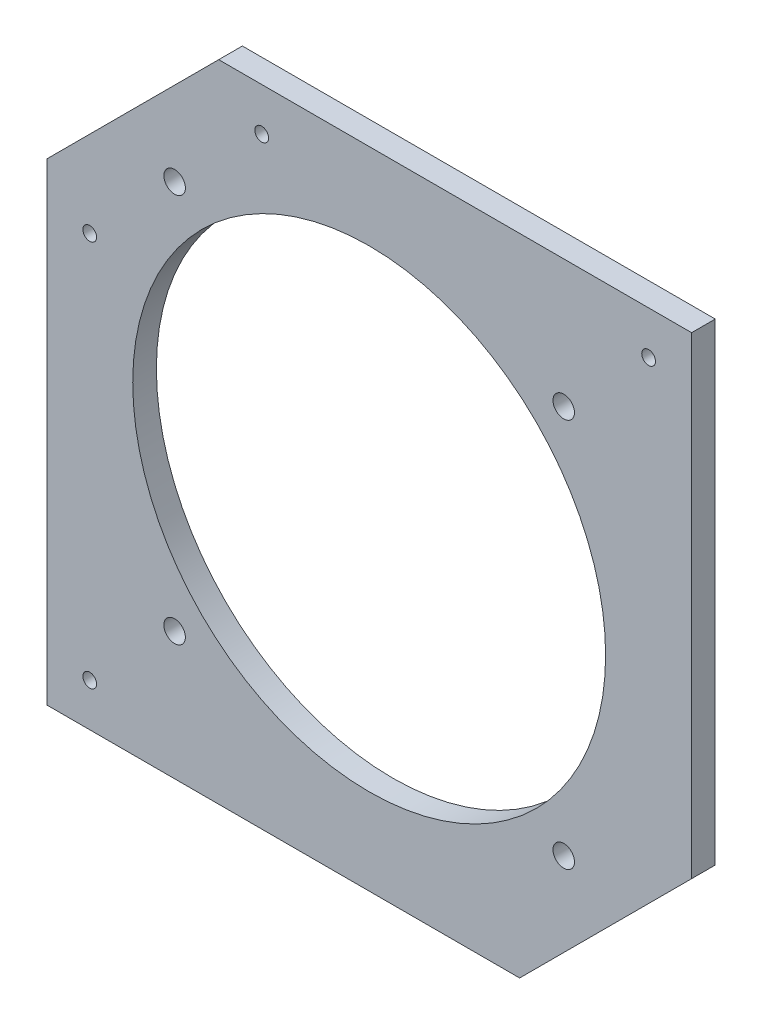
ISO-10303-21;
HEADER;
FILE_DESCRIPTION(('STEP AP214'),'2;1');
FILE_NAME('part.step','',(''),(''),'','','');
FILE_SCHEMA(('AUTOMOTIVE_DESIGN { 1 0 10303 214 1 1 1 1 }'));
ENDSEC;
DATA;
#1=APPLICATION_CONTEXT('core data for automotive mechanical design processes');
#2=APPLICATION_PROTOCOL_DEFINITION('international standard','automotive_design',2000,#1);
#3=PRODUCT_CONTEXT('',#1,'mechanical');
#4=PRODUCT('Part','Part','',(#3));
#5=PRODUCT_RELATED_PRODUCT_CATEGORY('part','',(#4));
#6=PRODUCT_DEFINITION_FORMATION('','',#4);
#7=PRODUCT_DEFINITION_CONTEXT('part definition',#1,'design');
#8=PRODUCT_DEFINITION('design','',#6,#7);
#9=PRODUCT_DEFINITION_SHAPE('','',#8);
#10=(LENGTH_UNIT() NAMED_UNIT(*) SI_UNIT(.MILLI.,.METRE.));
#11=(NAMED_UNIT(*) PLANE_ANGLE_UNIT() SI_UNIT($,.RADIAN.));
#12=(NAMED_UNIT(*) SI_UNIT($,.STERADIAN.) SOLID_ANGLE_UNIT());
#13=UNCERTAINTY_MEASURE_WITH_UNIT(LENGTH_MEASURE(1.E-05),#10,'distance_accuracy_value','');
#14=(GEOMETRIC_REPRESENTATION_CONTEXT(3) GLOBAL_UNCERTAINTY_ASSIGNED_CONTEXT((#13)) GLOBAL_UNIT_ASSIGNED_CONTEXT((#10,
#11,#12)) REPRESENTATION_CONTEXT('',''));
#15=CARTESIAN_POINT('',(0.,0.,0.));
#16=DIRECTION('',(0.,0.,1.));
#17=DIRECTION('',(1.,0.,0.));
#18=AXIS2_PLACEMENT_3D('',#15,#16,#17);
#19=CARTESIAN_POINT('',(75.,75.,5.5));
#20=DIRECTION('',(-1.,0.,0.));
#21=DIRECTION('',(0.,-1.,0.));
#22=AXIS2_PLACEMENT_3D('',#19,#20,#21);
#23=PLANE('',#22);
#24=DIRECTION('',(0.,1.,0.));
#25=VECTOR('',#24,1.);
#26=CARTESIAN_POINT('',(75.,75.,5.5));
#27=LINE('',#26,#25);
#28=CARTESIAN_POINT('',(75.,-35.,5.5));
#29=VERTEX_POINT('',#28);
#30=CARTESIAN_POINT('',(75.,75.,5.5));
#31=VERTEX_POINT('',#30);
#32=EDGE_CURVE('E95',#29,#31,#27,.T.);
#33=ORIENTED_EDGE('',*,*,#32,.F.);
#34=DIRECTION('',(0.,0.,-1.));
#35=VECTOR('',#34,1.);
#36=CARTESIAN_POINT('',(75.,-35.,5.5));
#37=LINE('',#36,#35);
#38=CARTESIAN_POINT('',(75.,-35.,0.));
#39=VERTEX_POINT('',#38);
#40=EDGE_CURVE('E148',#29,#39,#37,.T.);
#41=ORIENTED_EDGE('',*,*,#40,.T.);
#42=DIRECTION('',(0.,1.,0.));
#43=VECTOR('',#42,1.);
#44=CARTESIAN_POINT('',(75.,75.,0.));
#45=LINE('',#44,#43);
#46=CARTESIAN_POINT('',(75.,75.,0.));
#47=VERTEX_POINT('',#46);
#48=EDGE_CURVE('E116',#39,#47,#45,.T.);
#49=ORIENTED_EDGE('',*,*,#48,.T.);
#50=DIRECTION('',(0.,0.,-1.));
#51=VECTOR('',#50,1.);
#52=CARTESIAN_POINT('',(75.,75.,5.5));
#53=LINE('',#52,#51);
#54=EDGE_CURVE('E111',#31,#47,#53,.T.);
#55=ORIENTED_EDGE('',*,*,#54,.F.);
#56=EDGE_LOOP('',(#33,#41,#49,#55));
#57=FACE_BOUND('',#56,.T.);
#58=ADVANCED_FACE('F41',(#57),#23,.F.);
#59=CARTESIAN_POINT('',(-75.,75.,5.5));
#60=DIRECTION('',(0.,-1.,0.));
#61=DIRECTION('',(0.,0.,-1.));
#62=AXIS2_PLACEMENT_3D('',#59,#60,#61);
#63=PLANE('',#62);
#64=DIRECTION('',(-1.,0.,0.));
#65=VECTOR('',#64,1.);
#66=CARTESIAN_POINT('',(-75.,75.,0.));
#67=LINE('',#66,#65);
#68=CARTESIAN_POINT('',(-34.9999999999998,75.,0.));
#69=VERTEX_POINT('',#68);
#70=EDGE_CURVE('E152',#47,#69,#67,.T.);
#71=ORIENTED_EDGE('',*,*,#70,.T.);
#72=DIRECTION('',(0.,0.,1.));
#73=VECTOR('',#72,1.);
#74=CARTESIAN_POINT('',(-34.9999999999998,75.,5.5));
#75=LINE('',#74,#73);
#76=CARTESIAN_POINT('',(-34.9999999999998,75.,5.5));
#77=VERTEX_POINT('',#76);
#78=EDGE_CURVE('E113',#69,#77,#75,.T.);
#79=ORIENTED_EDGE('',*,*,#78,.T.);
#80=DIRECTION('',(-1.,0.,0.));
#81=VECTOR('',#80,1.);
#82=CARTESIAN_POINT('',(-75.,75.,5.5));
#83=LINE('',#82,#81);
#84=EDGE_CURVE('E98',#31,#77,#83,.T.);
#85=ORIENTED_EDGE('',*,*,#84,.F.);
#86=ORIENTED_EDGE('',*,*,#54,.T.);
#87=EDGE_LOOP('',(#71,#79,#85,#86));
#88=FACE_BOUND('',#87,.T.);
#89=ADVANCED_FACE('F110',(#88),#63,.F.);
#90=CARTESIAN_POINT('',(-75.,75.,5.5));
#91=DIRECTION('',(1.,0.,0.));
#92=DIRECTION('',(0.,1.,0.));
#93=AXIS2_PLACEMENT_3D('',#90,#91,#92);
#94=PLANE('',#93);
#95=DIRECTION('',(0.,-1.,0.));
#96=VECTOR('',#95,1.);
#97=CARTESIAN_POINT('',(-75.,75.,5.5));
#98=LINE('',#97,#96);
#99=CARTESIAN_POINT('',(-75.,35.,5.5));
#100=VERTEX_POINT('',#99);
#101=CARTESIAN_POINT('',(-75.,-75.,5.5));
#102=VERTEX_POINT('',#101);
#103=EDGE_CURVE('E114',#100,#102,#98,.T.);
#104=ORIENTED_EDGE('',*,*,#103,.F.);
#105=DIRECTION('',(0.,0.,-1.));
#106=VECTOR('',#105,1.);
#107=CARTESIAN_POINT('',(-75.,35.,5.5));
#108=LINE('',#107,#106);
#109=CARTESIAN_POINT('',(-75.,35.,0.));
#110=VERTEX_POINT('',#109);
#111=EDGE_CURVE('E118',#100,#110,#108,.T.);
#112=ORIENTED_EDGE('',*,*,#111,.T.);
#113=DIRECTION('',(0.,-1.,0.));
#114=VECTOR('',#113,1.);
#115=CARTESIAN_POINT('',(-75.,75.,0.));
#116=LINE('',#115,#114);
#117=CARTESIAN_POINT('',(-75.,-75.,0.));
#118=VERTEX_POINT('',#117);
#119=EDGE_CURVE('E154',#110,#118,#116,.T.);
#120=ORIENTED_EDGE('',*,*,#119,.T.);
#121=DIRECTION('',(0.,0.,-1.));
#122=VECTOR('',#121,1.);
#123=CARTESIAN_POINT('',(-75.,-75.,5.5));
#124=LINE('',#123,#122);
#125=EDGE_CURVE('E119',#102,#118,#124,.T.);
#126=ORIENTED_EDGE('',*,*,#125,.F.);
#127=EDGE_LOOP('',(#104,#112,#120,#126));
#128=FACE_BOUND('',#127,.T.);
#129=ADVANCED_FACE('F181',(#128),#94,.F.);
#130=CARTESIAN_POINT('',(-75.,-75.,5.5));
#131=DIRECTION('',(0.,1.,0.));
#132=DIRECTION('',(0.,0.,1.));
#133=AXIS2_PLACEMENT_3D('',#130,#131,#132);
#134=PLANE('',#133);
#135=DIRECTION('',(1.,0.,0.));
#136=VECTOR('',#135,1.);
#137=CARTESIAN_POINT('',(-75.,-75.,0.));
#138=LINE('',#137,#136);
#139=CARTESIAN_POINT('',(34.9999999999999,-75.,0.));
#140=VERTEX_POINT('',#139);
#141=EDGE_CURVE('E105',#118,#140,#138,.T.);
#142=ORIENTED_EDGE('',*,*,#141,.T.);
#143=DIRECTION('',(0.,0.,1.));
#144=VECTOR('',#143,1.);
#145=CARTESIAN_POINT('',(34.9999999999999,-75.,5.5));
#146=LINE('',#145,#144);
#147=CARTESIAN_POINT('',(34.9999999999999,-75.,5.5));
#148=VERTEX_POINT('',#147);
#149=EDGE_CURVE('E50',#140,#148,#146,.T.);
#150=ORIENTED_EDGE('',*,*,#149,.T.);
#151=DIRECTION('',(1.,0.,0.));
#152=VECTOR('',#151,1.);
#153=CARTESIAN_POINT('',(-75.,-75.,5.5));
#154=LINE('',#153,#152);
#155=EDGE_CURVE('E125',#102,#148,#154,.T.);
#156=ORIENTED_EDGE('',*,*,#155,.F.);
#157=ORIENTED_EDGE('',*,*,#125,.T.);
#158=EDGE_LOOP('',(#142,#150,#156,#157));
#159=FACE_BOUND('',#158,.T.);
#160=ADVANCED_FACE('F159',(#159),#134,.F.);
#161=CARTESIAN_POINT('',(0.,0.,5.5));
#162=DIRECTION('',(0.,0.,1.));
#163=DIRECTION('',(1.,0.,0.));
#164=AXIS2_PLACEMENT_3D('',#161,#162,#163);
#165=PLANE('',#164);
#166=CARTESIAN_POINT('',(-25.,65.,5.5));
#167=DIRECTION('',(0.,0.,1.));
#168=DIRECTION('',(0.,1.,0.));
#169=AXIS2_PLACEMENT_3D('',#166,#167,#168);
#170=CIRCLE('',#169,1.60000000000001);
#171=CARTESIAN_POINT('',(-25.,66.6,5.5));
#172=VERTEX_POINT('',#171);
#173=EDGE_CURVE('E233',#172,#172,#170,.T.);
#174=ORIENTED_EDGE('',*,*,#173,.F.);
#175=EDGE_LOOP('',(#174));
#176=FACE_BOUND('',#175,.T.);
#177=CARTESIAN_POINT('',(65.,65.,5.5));
#178=DIRECTION('',(0.,0.,1.));
#179=DIRECTION('',(0.,1.,0.));
#180=AXIS2_PLACEMENT_3D('',#177,#178,#179);
#181=CIRCLE('',#180,1.60000000000001);
#182=CARTESIAN_POINT('',(65.,66.6,5.5));
#183=VERTEX_POINT('',#182);
#184=EDGE_CURVE('E241',#183,#183,#181,.T.);
#185=ORIENTED_EDGE('',*,*,#184,.F.);
#186=EDGE_LOOP('',(#185));
#187=FACE_BOUND('',#186,.T.);
#188=CARTESIAN_POINT('',(-65.,25.,5.5));
#189=DIRECTION('',(0.,0.,-1.));
#190=DIRECTION('',(-1.,0.,0.));
#191=AXIS2_PLACEMENT_3D('',#188,#189,#190);
#192=CIRCLE('',#191,1.60000000000001);
#193=CARTESIAN_POINT('',(-66.6,25.,5.5));
#194=VERTEX_POINT('',#193);
#195=EDGE_CURVE('E247',#194,#194,#192,.T.);
#196=ORIENTED_EDGE('',*,*,#195,.T.);
#197=EDGE_LOOP('',(#196));
#198=FACE_BOUND('',#197,.T.);
#199=CARTESIAN_POINT('',(-65.,-65.,5.5));
#200=DIRECTION('',(0.,0.,-1.));
#201=DIRECTION('',(-1.,0.,0.));
#202=AXIS2_PLACEMENT_3D('',#199,#200,#201);
#203=CIRCLE('',#202,1.60000000000001);
#204=CARTESIAN_POINT('',(-66.6,-65.,5.5));
#205=VERTEX_POINT('',#204);
#206=EDGE_CURVE('E253',#205,#205,#203,.T.);
#207=ORIENTED_EDGE('',*,*,#206,.T.);
#208=EDGE_LOOP('',(#207));
#209=FACE_BOUND('',#208,.T.);
#210=CARTESIAN_POINT('',(45.2548339959389,45.2548339959391,5.5));
#211=DIRECTION('',(0.,0.,-1.));
#212=DIRECTION('',(0.,-1.,0.));
#213=AXIS2_PLACEMENT_3D('',#210,#211,#212);
#214=CIRCLE('',#213,2.50000000000001);
#215=CARTESIAN_POINT('',(45.254833995939,42.7548339959391,5.5));
#216=VERTEX_POINT('',#215);
#217=EDGE_CURVE('E137',#216,#216,#214,.T.);
#218=ORIENTED_EDGE('',*,*,#217,.T.);
#219=EDGE_LOOP('',(#218));
#220=FACE_BOUND('',#219,.T.);
#221=CARTESIAN_POINT('',(-45.2548339959389,45.2548339959391,5.5));
#222=DIRECTION('',(0.,0.,-1.));
#223=DIRECTION('',(1.,0.,0.));
#224=AXIS2_PLACEMENT_3D('',#221,#222,#223);
#225=CIRCLE('',#224,2.50000000000001);
#226=CARTESIAN_POINT('',(-42.7548339959389,45.2548339959391,5.5));
#227=VERTEX_POINT('',#226);
#228=EDGE_CURVE('E261',#227,#227,#225,.T.);
#229=ORIENTED_EDGE('',*,*,#228,.T.);
#230=EDGE_LOOP('',(#229));
#231=FACE_BOUND('',#230,.T.);
#232=CARTESIAN_POINT('',(-45.2548339959386,-45.2548339959394,5.5));
#233=DIRECTION('',(0.,0.,-1.));
#234=DIRECTION('',(0.,1.,0.));
#235=AXIS2_PLACEMENT_3D('',#232,#233,#234);
#236=CIRCLE('',#235,2.50000000000001);
#237=CARTESIAN_POINT('',(-45.2548339959387,-42.7548339959394,5.5));
#238=VERTEX_POINT('',#237);
#239=EDGE_CURVE('E256',#238,#238,#236,.T.);
#240=ORIENTED_EDGE('',*,*,#239,.T.);
#241=EDGE_LOOP('',(#240));
#242=FACE_BOUND('',#241,.T.);
#243=CARTESIAN_POINT('',(0.,0.,5.5));
#244=DIRECTION('',(0.,0.,-1.));
#245=DIRECTION('',(-1.,0.,0.));
#246=AXIS2_PLACEMENT_3D('',#243,#244,#245);
#247=CIRCLE('',#246,54.9999999999999);
#248=CARTESIAN_POINT('',(-55.,0.,5.5));
#249=VERTEX_POINT('',#248);
#250=EDGE_CURVE('E266',#249,#249,#247,.T.);
#251=ORIENTED_EDGE('',*,*,#250,.T.);
#252=EDGE_LOOP('',(#251));
#253=FACE_BOUND('',#252,.T.);
#254=CARTESIAN_POINT('',(45.2548339959389,-45.2548339959391,5.5));
#255=DIRECTION('',(0.,0.,-1.));
#256=DIRECTION('',(-1.,0.,0.));
#257=AXIS2_PLACEMENT_3D('',#254,#255,#256);
#258=CIRCLE('',#257,2.50000000000001);
#259=CARTESIAN_POINT('',(42.7548339959389,-45.2548339959391,5.5));
#260=VERTEX_POINT('',#259);
#261=EDGE_CURVE('E132',#260,#260,#258,.T.);
#262=ORIENTED_EDGE('',*,*,#261,.T.);
#263=EDGE_LOOP('',(#262));
#264=FACE_BOUND('',#263,.T.);
#265=ORIENTED_EDGE('',*,*,#155,.T.);
#266=DIRECTION('',(-0.707106781186549,-0.707106781186546,0.));
#267=VECTOR('',#266,1.);
#268=CARTESIAN_POINT('',(54.9999999999999,-55.,5.5));
#269=LINE('',#268,#267);
#270=EDGE_CURVE('E11',#148,#29,#269,.F.);
#271=ORIENTED_EDGE('',*,*,#270,.T.);
#272=ORIENTED_EDGE('',*,*,#32,.T.);
#273=ORIENTED_EDGE('',*,*,#84,.T.);
#274=DIRECTION('',(0.707106781186549,0.707106781186546,0.));
#275=VECTOR('',#274,1.);
#276=CARTESIAN_POINT('',(-54.9999999999999,55.,5.5));
#277=LINE('',#276,#275);
#278=EDGE_CURVE('E146',#77,#100,#277,.F.);
#279=ORIENTED_EDGE('',*,*,#278,.T.);
#280=ORIENTED_EDGE('',*,*,#103,.T.);
#281=EDGE_LOOP('',(#265,#271,#272,#273,#279,#280));
#282=FACE_BOUND('',#281,.T.);
#283=ADVANCED_FACE('F97',(#176,#187,#198,#209,#220,#231,#242,#253,#264,#282),#165,.T.);
#284=CARTESIAN_POINT('',(0.,0.,0.));
#285=DIRECTION('',(0.,0.,1.));
#286=DIRECTION('',(1.,0.,0.));
#287=AXIS2_PLACEMENT_3D('',#284,#285,#286);
#288=PLANE('',#287);
#289=CARTESIAN_POINT('',(-25.,65.,0.));
#290=DIRECTION('',(0.,0.,1.));
#291=DIRECTION('',(0.,1.,0.));
#292=AXIS2_PLACEMENT_3D('',#289,#290,#291);
#293=CIRCLE('',#292,1.60000000000001);
#294=CARTESIAN_POINT('',(-25.,66.6,0.));
#295=VERTEX_POINT('',#294);
#296=EDGE_CURVE('E236',#295,#295,#293,.T.);
#297=ORIENTED_EDGE('',*,*,#296,.T.);
#298=EDGE_LOOP('',(#297));
#299=FACE_BOUND('',#298,.T.);
#300=CARTESIAN_POINT('',(65.,65.,0.));
#301=DIRECTION('',(0.,0.,1.));
#302=DIRECTION('',(0.,1.,0.));
#303=AXIS2_PLACEMENT_3D('',#300,#301,#302);
#304=CIRCLE('',#303,1.60000000000001);
#305=CARTESIAN_POINT('',(65.,66.6,0.));
#306=VERTEX_POINT('',#305);
#307=EDGE_CURVE('E238',#306,#306,#304,.T.);
#308=ORIENTED_EDGE('',*,*,#307,.T.);
#309=EDGE_LOOP('',(#308));
#310=FACE_BOUND('',#309,.T.);
#311=CARTESIAN_POINT('',(-65.,25.,0.));
#312=DIRECTION('',(0.,0.,-1.));
#313=DIRECTION('',(-1.,0.,0.));
#314=AXIS2_PLACEMENT_3D('',#311,#312,#313);
#315=CIRCLE('',#314,1.60000000000001);
#316=CARTESIAN_POINT('',(-66.6,25.,0.));
#317=VERTEX_POINT('',#316);
#318=EDGE_CURVE('E244',#317,#317,#315,.T.);
#319=ORIENTED_EDGE('',*,*,#318,.F.);
#320=EDGE_LOOP('',(#319));
#321=FACE_BOUND('',#320,.T.);
#322=CARTESIAN_POINT('',(-65.,-65.,0.));
#323=DIRECTION('',(0.,0.,-1.));
#324=DIRECTION('',(-1.,0.,0.));
#325=AXIS2_PLACEMENT_3D('',#322,#323,#324);
#326=CIRCLE('',#325,1.60000000000001);
#327=CARTESIAN_POINT('',(-66.6,-65.,0.));
#328=VERTEX_POINT('',#327);
#329=EDGE_CURVE('E250',#328,#328,#326,.T.);
#330=ORIENTED_EDGE('',*,*,#329,.F.);
#331=EDGE_LOOP('',(#330));
#332=FACE_BOUND('',#331,.T.);
#333=CARTESIAN_POINT('',(45.2548339959389,45.2548339959391,0.));
#334=DIRECTION('',(0.,0.,1.));
#335=DIRECTION('',(1.,0.,0.));
#336=AXIS2_PLACEMENT_3D('',#333,#334,#335);
#337=CIRCLE('',#336,2.50000000000001);
#338=CARTESIAN_POINT('',(47.754833995939,45.2548339959391,0.));
#339=VERTEX_POINT('',#338);
#340=EDGE_CURVE('E140',#339,#339,#337,.T.);
#341=ORIENTED_EDGE('',*,*,#340,.T.);
#342=EDGE_LOOP('',(#341));
#343=FACE_BOUND('',#342,.T.);
#344=CARTESIAN_POINT('',(-45.2548339959389,45.2548339959391,0.));
#345=DIRECTION('',(0.,0.,1.));
#346=DIRECTION('',(1.,0.,0.));
#347=AXIS2_PLACEMENT_3D('',#344,#345,#346);
#348=CIRCLE('',#347,2.50000000000001);
#349=CARTESIAN_POINT('',(-42.7548339959389,45.2548339959391,0.));
#350=VERTEX_POINT('',#349);
#351=EDGE_CURVE('E136',#350,#350,#348,.T.);
#352=ORIENTED_EDGE('',*,*,#351,.T.);
#353=EDGE_LOOP('',(#352));
#354=FACE_BOUND('',#353,.T.);
#355=CARTESIAN_POINT('',(-45.2548339959386,-45.2548339959394,0.));
#356=DIRECTION('',(0.,0.,1.));
#357=DIRECTION('',(1.,0.,0.));
#358=AXIS2_PLACEMENT_3D('',#355,#356,#357);
#359=CIRCLE('',#358,2.50000000000001);
#360=CARTESIAN_POINT('',(-42.7548339959386,-45.2548339959394,0.));
#361=VERTEX_POINT('',#360);
#362=EDGE_CURVE('E133',#361,#361,#359,.T.);
#363=ORIENTED_EDGE('',*,*,#362,.T.);
#364=EDGE_LOOP('',(#363));
#365=FACE_BOUND('',#364,.T.);
#366=CARTESIAN_POINT('',(0.,0.,0.));
#367=DIRECTION('',(0.,0.,-1.));
#368=DIRECTION('',(-1.,0.,0.));
#369=AXIS2_PLACEMENT_3D('',#366,#367,#368);
#370=CIRCLE('',#369,54.9999999999999);
#371=CARTESIAN_POINT('',(-55.,0.,0.));
#372=VERTEX_POINT('',#371);
#373=EDGE_CURVE('E142',#372,#372,#370,.T.);
#374=ORIENTED_EDGE('',*,*,#373,.F.);
#375=EDGE_LOOP('',(#374));
#376=FACE_BOUND('',#375,.T.);
#377=CARTESIAN_POINT('',(45.2548339959389,-45.2548339959391,0.));
#378=DIRECTION('',(0.,0.,1.));
#379=DIRECTION('',(1.,0.,0.));
#380=AXIS2_PLACEMENT_3D('',#377,#378,#379);
#381=CIRCLE('',#380,2.50000000000001);
#382=CARTESIAN_POINT('',(47.7548339959389,-45.2548339959391,0.));
#383=VERTEX_POINT('',#382);
#384=EDGE_CURVE('E129',#383,#383,#381,.T.);
#385=ORIENTED_EDGE('',*,*,#384,.T.);
#386=EDGE_LOOP('',(#385));
#387=FACE_BOUND('',#386,.T.);
#388=ORIENTED_EDGE('',*,*,#48,.F.);
#389=DIRECTION('',(0.707106781186549,0.707106781186546,0.));
#390=VECTOR('',#389,1.);
#391=CARTESIAN_POINT('',(75.,-35.,0.));
#392=LINE('',#391,#390);
#393=EDGE_CURVE('E64',#39,#140,#392,.F.);
#394=ORIENTED_EDGE('',*,*,#393,.T.);
#395=ORIENTED_EDGE('',*,*,#141,.F.);
#396=ORIENTED_EDGE('',*,*,#119,.F.);
#397=DIRECTION('',(-0.707106781186549,-0.707106781186546,0.));
#398=VECTOR('',#397,1.);
#399=CARTESIAN_POINT('',(-75.,35.,0.));
#400=LINE('',#399,#398);
#401=EDGE_CURVE('E122',#110,#69,#400,.F.);
#402=ORIENTED_EDGE('',*,*,#401,.T.);
#403=ORIENTED_EDGE('',*,*,#70,.F.);
#404=EDGE_LOOP('',(#388,#394,#395,#396,#402,#403));
#405=FACE_BOUND('',#404,.T.);
#406=ADVANCED_FACE('F151',(#299,#310,#321,#332,#343,#354,#365,#376,#387,#405),#288,.F.);
#407=CARTESIAN_POINT('',(45.2548339959389,-45.2548339959391,5.5));
#408=DIRECTION('',(0.,0.,-1.));
#409=DIRECTION('',(-1.,0.,0.));
#410=AXIS2_PLACEMENT_3D('',#407,#408,#409);
#411=CYLINDRICAL_SURFACE('',#410,2.50000000000001);
#412=ORIENTED_EDGE('',*,*,#261,.F.);
#413=EDGE_LOOP('',(#412));
#414=FACE_BOUND('',#413,.T.);
#415=ORIENTED_EDGE('',*,*,#384,.F.);
#416=EDGE_LOOP('',(#415));
#417=FACE_BOUND('',#416,.T.);
#418=ADVANCED_FACE('F195',(#414,#417),#411,.F.);
#419=CARTESIAN_POINT('',(0.,0.,5.5));
#420=DIRECTION('',(0.,0.,-1.));
#421=DIRECTION('',(-1.,0.,0.));
#422=AXIS2_PLACEMENT_3D('',#419,#420,#421);
#423=CYLINDRICAL_SURFACE('',#422,54.9999999999999);
#424=ORIENTED_EDGE('',*,*,#250,.F.);
#425=EDGE_LOOP('',(#424));
#426=FACE_BOUND('',#425,.T.);
#427=ORIENTED_EDGE('',*,*,#373,.T.);
#428=EDGE_LOOP('',(#427));
#429=FACE_BOUND('',#428,.T.);
#430=ADVANCED_FACE('F202',(#426,#429),#423,.F.);
#431=CARTESIAN_POINT('',(-45.2548339959386,-45.2548339959394,5.5));
#432=DIRECTION('',(0.,0.,-1.));
#433=DIRECTION('',(-1.,0.,0.));
#434=AXIS2_PLACEMENT_3D('',#431,#432,#433);
#435=CYLINDRICAL_SURFACE('',#434,2.50000000000001);
#436=ORIENTED_EDGE('',*,*,#239,.F.);
#437=EDGE_LOOP('',(#436));
#438=FACE_BOUND('',#437,.T.);
#439=ORIENTED_EDGE('',*,*,#362,.F.);
#440=EDGE_LOOP('',(#439));
#441=FACE_BOUND('',#440,.T.);
#442=ADVANCED_FACE('F206',(#438,#441),#435,.F.);
#443=CARTESIAN_POINT('',(-45.2548339959389,45.2548339959391,5.5));
#444=DIRECTION('',(0.,0.,-1.));
#445=DIRECTION('',(-1.,0.,0.));
#446=AXIS2_PLACEMENT_3D('',#443,#444,#445);
#447=CYLINDRICAL_SURFACE('',#446,2.50000000000001);
#448=ORIENTED_EDGE('',*,*,#228,.F.);
#449=EDGE_LOOP('',(#448));
#450=FACE_BOUND('',#449,.T.);
#451=ORIENTED_EDGE('',*,*,#351,.F.);
#452=EDGE_LOOP('',(#451));
#453=FACE_BOUND('',#452,.T.);
#454=ADVANCED_FACE('F210',(#450,#453),#447,.F.);
#455=CARTESIAN_POINT('',(45.2548339959389,45.2548339959391,5.5));
#456=DIRECTION('',(0.,0.,-1.));
#457=DIRECTION('',(-1.,0.,0.));
#458=AXIS2_PLACEMENT_3D('',#455,#456,#457);
#459=CYLINDRICAL_SURFACE('',#458,2.50000000000001);
#460=ORIENTED_EDGE('',*,*,#217,.F.);
#461=EDGE_LOOP('',(#460));
#462=FACE_BOUND('',#461,.T.);
#463=ORIENTED_EDGE('',*,*,#340,.F.);
#464=EDGE_LOOP('',(#463));
#465=FACE_BOUND('',#464,.T.);
#466=ADVANCED_FACE('F214',(#462,#465),#459,.F.);
#467=CARTESIAN_POINT('',(-65.,-65.,5.5));
#468=DIRECTION('',(0.,0.,-1.));
#469=DIRECTION('',(-1.,0.,0.));
#470=AXIS2_PLACEMENT_3D('',#467,#468,#469);
#471=CYLINDRICAL_SURFACE('',#470,1.60000000000001);
#472=ORIENTED_EDGE('',*,*,#206,.F.);
#473=EDGE_LOOP('',(#472));
#474=FACE_BOUND('',#473,.T.);
#475=ORIENTED_EDGE('',*,*,#329,.T.);
#476=EDGE_LOOP('',(#475));
#477=FACE_BOUND('',#476,.T.);
#478=ADVANCED_FACE('F172',(#474,#477),#471,.F.);
#479=CARTESIAN_POINT('',(-75.,35.,5.5));
#480=DIRECTION('',(0.707106781186546,-0.707106781186549,0.));
#481=DIRECTION('',(0.,0.,-1.));
#482=AXIS2_PLACEMENT_3D('',#479,#480,#481);
#483=PLANE('',#482);
#484=ORIENTED_EDGE('',*,*,#278,.F.);
#485=ORIENTED_EDGE('',*,*,#78,.F.);
#486=ORIENTED_EDGE('',*,*,#401,.F.);
#487=ORIENTED_EDGE('',*,*,#111,.F.);
#488=EDGE_LOOP('',(#484,#485,#486,#487));
#489=FACE_BOUND('',#488,.T.);
#490=ADVANCED_FACE('F164',(#489),#483,.F.);
#491=CARTESIAN_POINT('',(75.,-35.,5.5));
#492=DIRECTION('',(-0.707106781186546,0.707106781186549,0.));
#493=DIRECTION('',(0.,0.,-1.));
#494=AXIS2_PLACEMENT_3D('',#491,#492,#493);
#495=PLANE('',#494);
#496=ORIENTED_EDGE('',*,*,#270,.F.);
#497=ORIENTED_EDGE('',*,*,#149,.F.);
#498=ORIENTED_EDGE('',*,*,#393,.F.);
#499=ORIENTED_EDGE('',*,*,#40,.F.);
#500=EDGE_LOOP('',(#496,#497,#498,#499));
#501=FACE_BOUND('',#500,.T.);
#502=ADVANCED_FACE('F44',(#501),#495,.F.);
#503=CARTESIAN_POINT('',(-65.,25.,5.5));
#504=DIRECTION('',(0.,0.,-1.));
#505=DIRECTION('',(-1.,0.,0.));
#506=AXIS2_PLACEMENT_3D('',#503,#504,#505);
#507=CYLINDRICAL_SURFACE('',#506,1.60000000000001);
#508=ORIENTED_EDGE('',*,*,#195,.F.);
#509=EDGE_LOOP('',(#508));
#510=FACE_BOUND('',#509,.T.);
#511=ORIENTED_EDGE('',*,*,#318,.T.);
#512=EDGE_LOOP('',(#511));
#513=FACE_BOUND('',#512,.T.);
#514=ADVANCED_FACE('F163',(#510,#513),#507,.F.);
#515=CARTESIAN_POINT('',(65.,65.,5.5));
#516=DIRECTION('',(0.,0.,-1.));
#517=DIRECTION('',(-1.,0.,0.));
#518=AXIS2_PLACEMENT_3D('',#515,#516,#517);
#519=CYLINDRICAL_SURFACE('',#518,1.60000000000001);
#520=ORIENTED_EDGE('',*,*,#184,.T.);
#521=EDGE_LOOP('',(#520));
#522=FACE_BOUND('',#521,.T.);
#523=ORIENTED_EDGE('',*,*,#307,.F.);
#524=EDGE_LOOP('',(#523));
#525=FACE_BOUND('',#524,.T.);
#526=ADVANCED_FACE('F169',(#522,#525),#519,.F.);
#527=CARTESIAN_POINT('',(-25.,65.,5.5));
#528=DIRECTION('',(0.,0.,-1.));
#529=DIRECTION('',(-1.,0.,0.));
#530=AXIS2_PLACEMENT_3D('',#527,#528,#529);
#531=CYLINDRICAL_SURFACE('',#530,1.60000000000001);
#532=ORIENTED_EDGE('',*,*,#173,.T.);
#533=EDGE_LOOP('',(#532));
#534=FACE_BOUND('',#533,.T.);
#535=ORIENTED_EDGE('',*,*,#296,.F.);
#536=EDGE_LOOP('',(#535));
#537=FACE_BOUND('',#536,.T.);
#538=ADVANCED_FACE('F224',(#534,#537),#531,.F.);
#539=CLOSED_SHELL('',(#58,#89,#129,#160,#283,#406,#418,#430,#442,#454,#466,#478,#490,#502,#514,
#526,#538));
#540=MANIFOLD_SOLID_BREP('B2',#539);
#541=ADVANCED_BREP_SHAPE_REPRESENTATION('',(#18,#540),#14);
#542=SHAPE_DEFINITION_REPRESENTATION(#9,#541);
ENDSEC;
END-ISO-10303-21;
